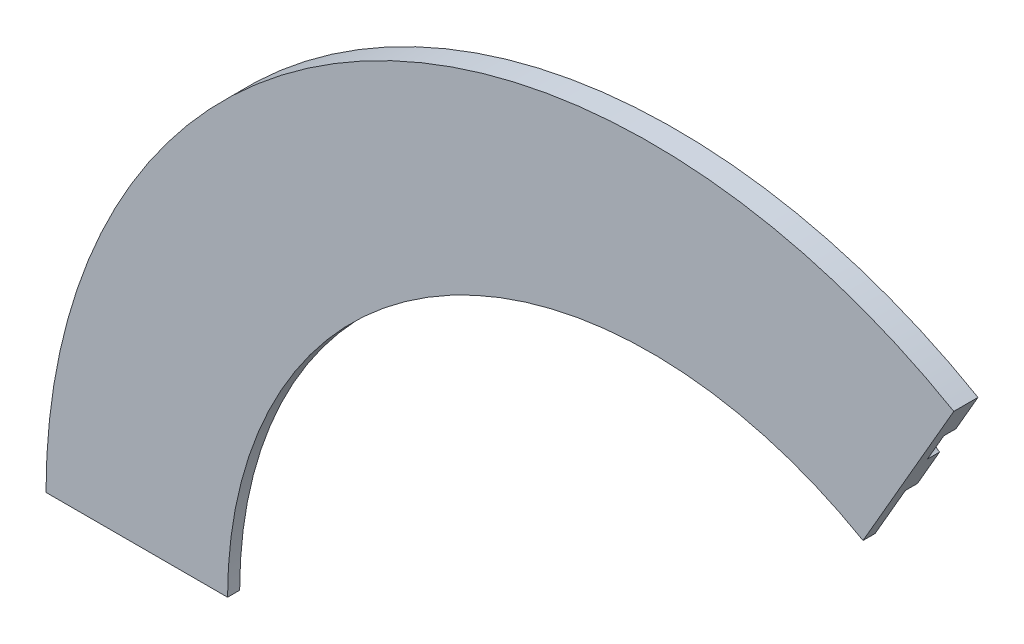
ISO-10303-21;
HEADER;
FILE_DESCRIPTION(('STEP AP214'),'2;1');
FILE_NAME('part.step','',(''),(''),'','','');
FILE_SCHEMA(('AUTOMOTIVE_DESIGN { 1 0 10303 214 1 1 1 1 }'));
ENDSEC;
DATA;
#1=APPLICATION_CONTEXT('core data for automotive mechanical design processes');
#2=APPLICATION_PROTOCOL_DEFINITION('international standard','automotive_design',2000,#1);
#3=PRODUCT_CONTEXT('',#1,'mechanical');
#4=PRODUCT('Part','Part','',(#3));
#5=PRODUCT_RELATED_PRODUCT_CATEGORY('part','',(#4));
#6=PRODUCT_DEFINITION_FORMATION('','',#4);
#7=PRODUCT_DEFINITION_CONTEXT('part definition',#1,'design');
#8=PRODUCT_DEFINITION('design','',#6,#7);
#9=PRODUCT_DEFINITION_SHAPE('','',#8);
#10=(LENGTH_UNIT() NAMED_UNIT(*) SI_UNIT(.MILLI.,.METRE.));
#11=(NAMED_UNIT(*) PLANE_ANGLE_UNIT() SI_UNIT($,.RADIAN.));
#12=(NAMED_UNIT(*) SI_UNIT($,.STERADIAN.) SOLID_ANGLE_UNIT());
#13=UNCERTAINTY_MEASURE_WITH_UNIT(LENGTH_MEASURE(1.E-05),#10,'distance_accuracy_value','');
#14=(GEOMETRIC_REPRESENTATION_CONTEXT(3) GLOBAL_UNCERTAINTY_ASSIGNED_CONTEXT((#13)) GLOBAL_UNIT_ASSIGNED_CONTEXT((#10,
#11,#12)) REPRESENTATION_CONTEXT('',''));
#15=CARTESIAN_POINT('',(0.,0.,0.));
#16=DIRECTION('',(0.,0.,1.));
#17=DIRECTION('',(1.,0.,0.));
#18=AXIS2_PLACEMENT_3D('',#15,#16,#17);
#19=CARTESIAN_POINT('',(0.,0.,0.));
#20=DIRECTION('',(0.,0.,1.));
#21=DIRECTION('',(1.,0.,0.));
#22=AXIS2_PLACEMENT_3D('',#19,#20,#21);
#23=PLANE('',#22);
#24=CARTESIAN_POINT('',(-176.066568132085,37.4241043471955,0.));
#25=DIRECTION('',(0.,0.,1.));
#26=DIRECTION('',(1.,0.,0.));
#27=AXIS2_PLACEMENT_3D('',#24,#25,#26);
#28=CIRCLE('',#27,5.40000000000004);
#29=CARTESIAN_POINT('',(-170.666568132085,37.4241043471955,0.));
#30=VERTEX_POINT('',#29);
#31=EDGE_CURVE('E141',#30,#30,#28,.T.);
#32=ORIENTED_EDGE('',*,*,#31,.T.);
#33=EDGE_LOOP('',(#32));
#34=FACE_BOUND('',#33,.T.);
#35=CARTESIAN_POINT('',(-164.438182375669,73.2125957536425,0.));
#36=DIRECTION('',(0.,0.,1.));
#37=DIRECTION('',(1.,0.,0.));
#38=AXIS2_PLACEMENT_3D('',#35,#36,#37);
#39=CIRCLE('',#38,5.40000000000011);
#40=CARTESIAN_POINT('',(-159.038182375669,73.2125957536425,0.));
#41=VERTEX_POINT('',#40);
#42=EDGE_CURVE('E144',#41,#41,#39,.T.);
#43=ORIENTED_EDGE('',*,*,#42,.T.);
#44=EDGE_LOOP('',(#43));
#45=FACE_BOUND('',#44,.T.);
#46=CARTESIAN_POINT('',(-145.623058987491,105.801345412644,0.));
#47=DIRECTION('',(0.,0.,1.));
#48=DIRECTION('',(1.,0.,0.));
#49=AXIS2_PLACEMENT_3D('',#46,#47,#48);
#50=CIRCLE('',#49,5.40000000000024);
#51=CARTESIAN_POINT('',(-140.223058987491,105.801345412644,0.));
#52=VERTEX_POINT('',#51);
#53=EDGE_CURVE('E147',#52,#52,#50,.T.);
#54=ORIENTED_EDGE('',*,*,#53,.T.);
#55=EDGE_LOOP('',(#54));
#56=FACE_BOUND('',#55,.T.);
#57=CARTESIAN_POINT('',(-120.443509144596,133.76606858593,0.));
#58=DIRECTION('',(0.,0.,1.));
#59=DIRECTION('',(1.,0.,0.));
#60=AXIS2_PLACEMENT_3D('',#57,#58,#59);
#61=CIRCLE('',#60,5.40000000000034);
#62=CARTESIAN_POINT('',(-115.043509144595,133.76606858593,0.));
#63=VERTEX_POINT('',#62);
#64=EDGE_CURVE('E150',#63,#63,#61,.T.);
#65=ORIENTED_EDGE('',*,*,#64,.T.);
#66=EDGE_LOOP('',(#65));
#67=FACE_BOUND('',#66,.T.);
#68=CARTESIAN_POINT('',(-90.0000000000019,155.884572681198,0.));
#69=DIRECTION('',(0.,0.,1.));
#70=DIRECTION('',(1.,0.,0.));
#71=AXIS2_PLACEMENT_3D('',#68,#69,#70);
#72=CIRCLE('',#71,5.40000000000049);
#73=CARTESIAN_POINT('',(-84.6000000000014,155.884572681198,0.));
#74=VERTEX_POINT('',#73);
#75=EDGE_CURVE('E153',#74,#74,#72,.T.);
#76=ORIENTED_EDGE('',*,*,#75,.T.);
#77=EDGE_LOOP('',(#76));
#78=FACE_BOUND('',#77,.T.);
#79=CARTESIAN_POINT('',(-55.6230589874907,171.190172933128,0.));
#80=DIRECTION('',(0.,0.,1.));
#81=DIRECTION('',(1.,0.,0.));
#82=AXIS2_PLACEMENT_3D('',#79,#80,#81);
#83=CIRCLE('',#82,5.39999999999888);
#84=CARTESIAN_POINT('',(-50.2230589874918,171.190172933128,0.));
#85=VERTEX_POINT('',#84);
#86=EDGE_CURVE('E156',#85,#85,#83,.T.);
#87=ORIENTED_EDGE('',*,*,#86,.T.);
#88=EDGE_LOOP('',(#87));
#89=FACE_BOUND('',#88,.T.);
#90=CARTESIAN_POINT('',(-18.8151233881776,179.013941166289,0.));
#91=DIRECTION('',(0.,0.,1.));
#92=DIRECTION('',(1.,0.,0.));
#93=AXIS2_PLACEMENT_3D('',#90,#91,#92);
#94=CIRCLE('',#93,5.39999999999871);
#95=CARTESIAN_POINT('',(-13.4151233881788,179.013941166289,0.));
#96=VERTEX_POINT('',#95);
#97=EDGE_CURVE('E159',#96,#96,#94,.T.);
#98=ORIENTED_EDGE('',*,*,#97,.T.);
#99=EDGE_LOOP('',(#98));
#100=FACE_BOUND('',#99,.T.);
#101=CARTESIAN_POINT('',(18.8151233881785,179.013941166289,0.));
#102=DIRECTION('',(0.,0.,1.));
#103=DIRECTION('',(1.,0.,0.));
#104=AXIS2_PLACEMENT_3D('',#101,#102,#103);
#105=CIRCLE('',#104,5.39999999999827);
#106=CARTESIAN_POINT('',(24.2151233881768,179.013941166289,0.));
#107=VERTEX_POINT('',#106);
#108=EDGE_CURVE('E162',#107,#107,#105,.T.);
#109=ORIENTED_EDGE('',*,*,#108,.T.);
#110=EDGE_LOOP('',(#109));
#111=FACE_BOUND('',#110,.T.);
#112=CARTESIAN_POINT('',(55.6230589874906,171.190172933128,0.));
#113=DIRECTION('',(0.,0.,1.));
#114=DIRECTION('',(1.,0.,0.));
#115=AXIS2_PLACEMENT_3D('',#112,#113,#114);
#116=CIRCLE('',#115,5.39999999999888);
#117=CARTESIAN_POINT('',(61.0230589874895,171.190172933128,0.));
#118=VERTEX_POINT('',#117);
#119=EDGE_CURVE('E165',#118,#118,#116,.T.);
#120=ORIENTED_EDGE('',*,*,#119,.T.);
#121=EDGE_LOOP('',(#120));
#122=FACE_BOUND('',#121,.T.);
#123=CARTESIAN_POINT('',(0.,0.,0.));
#124=DIRECTION('',(0.,0.,1.));
#125=DIRECTION('',(1.,0.,0.));
#126=AXIS2_PLACEMENT_3D('',#123,#124,#125);
#127=CIRCLE('',#126,200.);
#128=CARTESIAN_POINT('',(100.000000000001,173.205080756887,0.));
#129=VERTEX_POINT('',#128);
#130=CARTESIAN_POINT('',(-200.,0.,0.));
#131=VERTEX_POINT('',#130);
#132=EDGE_CURVE('E127',#129,#131,#127,.T.);
#133=ORIENTED_EDGE('',*,*,#132,.F.);
#134=DIRECTION('',(0.500000000000004,0.866025403784436,0.));
#135=VECTOR('',#134,1.);
#136=CARTESIAN_POINT('',(100.000000000001,173.205080756887,0.));
#137=LINE('',#136,#135);
#138=CARTESIAN_POINT('',(92.7000000000004,160.561109861634,0.));
#139=VERTEX_POINT('',#138);
#140=EDGE_CURVE('E131',#139,#129,#137,.T.);
#141=ORIENTED_EDGE('',*,*,#140,.F.);
#142=CARTESIAN_POINT('',(90.0000000000002,155.884572681199,0.));
#143=DIRECTION('',(0.,0.,1.));
#144=DIRECTION('',(1.,0.,0.));
#145=AXIS2_PLACEMENT_3D('',#142,#143,#144);
#146=CIRCLE('',#145,5.39999999999904);
#147=CARTESIAN_POINT('',(87.3000000000014,151.208035500764,0.));
#148=VERTEX_POINT('',#147);
#149=EDGE_CURVE('E168',#139,#148,#146,.T.);
#150=ORIENTED_EDGE('',*,*,#149,.T.);
#151=CARTESIAN_POINT('',(80.0000000000006,138.56406460551,0.));
#152=VERTEX_POINT('',#151);
#153=EDGE_CURVE('E121',#152,#148,#137,.T.);
#154=ORIENTED_EDGE('',*,*,#153,.F.);
#155=CARTESIAN_POINT('',(0.,0.,0.));
#156=DIRECTION('',(0.,0.,1.));
#157=DIRECTION('',(1.,0.,0.));
#158=AXIS2_PLACEMENT_3D('',#155,#156,#157);
#159=CIRCLE('',#158,160.);
#160=CARTESIAN_POINT('',(-160.,0.,0.));
#161=VERTEX_POINT('',#160);
#162=EDGE_CURVE('E135',#152,#161,#159,.T.);
#163=ORIENTED_EDGE('',*,*,#162,.T.);
#164=DIRECTION('',(1.,0.,0.));
#165=VECTOR('',#164,1.);
#166=CARTESIAN_POINT('',(-140.,0.,0.));
#167=LINE('',#166,#165);
#168=CARTESIAN_POINT('',(-174.6,0.,0.));
#169=VERTEX_POINT('',#168);
#170=EDGE_CURVE('E132',#169,#161,#167,.T.);
#171=ORIENTED_EDGE('',*,*,#170,.F.);
#172=CARTESIAN_POINT('',(-180.,-1.23512311489549E-12,0.));
#173=DIRECTION('',(0.,0.,1.));
#174=DIRECTION('',(1.,0.,0.));
#175=AXIS2_PLACEMENT_3D('',#172,#173,#174);
#176=CIRCLE('',#175,5.39999999999999);
#177=CARTESIAN_POINT('',(-185.4,0.,0.));
#178=VERTEX_POINT('',#177);
#179=EDGE_CURVE('E130',#169,#178,#176,.T.);
#180=ORIENTED_EDGE('',*,*,#179,.T.);
#181=EDGE_CURVE('E112',#131,#178,#167,.T.);
#182=ORIENTED_EDGE('',*,*,#181,.F.);
#183=EDGE_LOOP('',(#133,#141,#150,#154,#163,#171,#180,#182));
#184=FACE_BOUND('',#183,.T.);
#185=ADVANCED_FACE('F35',(#34,#45,#56,#67,#78,#89,#100,#111,#122,#184),#23,.F.);
#186=CARTESIAN_POINT('',(0.,0.,4.));
#187=DIRECTION('',(0.,0.,-1.));
#188=DIRECTION('',(-1.,0.,0.));
#189=AXIS2_PLACEMENT_3D('',#186,#187,#188);
#190=CYLINDRICAL_SURFACE('',#189,200.);
#191=CARTESIAN_POINT('',(0.,0.,8.));
#192=DIRECTION('',(0.,0.,1.));
#193=DIRECTION('',(1.,0.,0.));
#194=AXIS2_PLACEMENT_3D('',#191,#192,#193);
#195=CIRCLE('',#194,200.);
#196=CARTESIAN_POINT('',(100.000000000001,173.205080756887,8.));
#197=VERTEX_POINT('',#196);
#198=CARTESIAN_POINT('',(-200.,0.,8.));
#199=VERTEX_POINT('',#198);
#200=EDGE_CURVE('E207',#197,#199,#195,.T.);
#201=ORIENTED_EDGE('',*,*,#200,.F.);
#202=DIRECTION('',(0.,0.,-1.));
#203=VECTOR('',#202,1.);
#204=CARTESIAN_POINT('',(100.000000000001,173.205080756887,10.));
#205=LINE('',#204,#203);
#206=EDGE_CURVE('E120',#197,#129,#205,.T.);
#207=ORIENTED_EDGE('',*,*,#206,.T.);
#208=ORIENTED_EDGE('',*,*,#132,.T.);
#209=DIRECTION('',(0.,0.,-1.));
#210=VECTOR('',#209,1.);
#211=CARTESIAN_POINT('',(-200.,0.,10.));
#212=LINE('',#211,#210);
#213=EDGE_CURVE('E109',#199,#131,#212,.T.);
#214=ORIENTED_EDGE('',*,*,#213,.F.);
#215=EDGE_LOOP('',(#201,#207,#208,#214));
#216=FACE_BOUND('',#215,.T.);
#217=ADVANCED_FACE('F37',(#216),#190,.T.);
#218=CARTESIAN_POINT('',(0.,0.,4.));
#219=DIRECTION('',(0.,0.,-1.));
#220=DIRECTION('',(-1.,0.,0.));
#221=AXIS2_PLACEMENT_3D('',#218,#219,#220);
#222=CYLINDRICAL_SURFACE('',#221,160.);
#223=DIRECTION('',(0.,0.,-1.));
#224=VECTOR('',#223,1.);
#225=CARTESIAN_POINT('',(80.0000000000006,138.56406460551,4.));
#226=LINE('',#225,#224);
#227=CARTESIAN_POINT('',(80.0000000000007,138.56406460551,4.));
#228=VERTEX_POINT('',#227);
#229=EDGE_CURVE('E222',#228,#152,#226,.T.);
#230=ORIENTED_EDGE('',*,*,#229,.F.);
#231=CARTESIAN_POINT('',(0.,0.,4.));
#232=DIRECTION('',(0.,0.,1.));
#233=DIRECTION('',(1.,0.,0.));
#234=AXIS2_PLACEMENT_3D('',#231,#232,#233);
#235=CIRCLE('',#234,160.);
#236=CARTESIAN_POINT('',(-160.,0.,4.));
#237=VERTEX_POINT('',#236);
#238=EDGE_CURVE('E171',#228,#237,#235,.T.);
#239=ORIENTED_EDGE('',*,*,#238,.T.);
#240=DIRECTION('',(0.,0.,-1.));
#241=VECTOR('',#240,1.);
#242=CARTESIAN_POINT('',(-160.,0.,4.));
#243=LINE('',#242,#241);
#244=EDGE_CURVE('E235',#161,#237,#243,.F.);
#245=ORIENTED_EDGE('',*,*,#244,.F.);
#246=ORIENTED_EDGE('',*,*,#162,.F.);
#247=EDGE_LOOP('',(#230,#239,#245,#246));
#248=FACE_BOUND('',#247,.T.);
#249=ADVANCED_FACE('F276',(#248),#222,.F.);
#250=CARTESIAN_POINT('',(-180.,-1.23512311489549E-12,4.));
#251=DIRECTION('',(0.,0.,-1.));
#252=DIRECTION('',(-1.,0.,0.));
#253=AXIS2_PLACEMENT_3D('',#250,#251,#252);
#254=CYLINDRICAL_SURFACE('',#253,5.39999999999999);
#255=DIRECTION('',(0.,0.,-1.));
#256=VECTOR('',#255,1.);
#257=CARTESIAN_POINT('',(-174.6,0.,4.));
#258=LINE('',#257,#256);
#259=CARTESIAN_POINT('',(-174.6,0.,4.));
#260=VERTEX_POINT('',#259);
#261=EDGE_CURVE('E228',#260,#169,#258,.T.);
#262=ORIENTED_EDGE('',*,*,#261,.F.);
#263=CARTESIAN_POINT('',(-180.,-1.23512311489549E-12,4.));
#264=DIRECTION('',(0.,0.,1.));
#265=DIRECTION('',(1.,0.,0.));
#266=AXIS2_PLACEMENT_3D('',#263,#264,#265);
#267=CIRCLE('',#266,5.39999999999999);
#268=CARTESIAN_POINT('',(-185.4,0.,4.));
#269=VERTEX_POINT('',#268);
#270=EDGE_CURVE('E174',#260,#269,#267,.T.);
#271=ORIENTED_EDGE('',*,*,#270,.T.);
#272=DIRECTION('',(0.,0.,-1.));
#273=VECTOR('',#272,1.);
#274=CARTESIAN_POINT('',(-185.4,0.,4.));
#275=LINE('',#274,#273);
#276=EDGE_CURVE('E230',#178,#269,#275,.F.);
#277=ORIENTED_EDGE('',*,*,#276,.F.);
#278=ORIENTED_EDGE('',*,*,#179,.F.);
#279=EDGE_LOOP('',(#262,#271,#277,#278));
#280=FACE_BOUND('',#279,.T.);
#281=ADVANCED_FACE('F281',(#280),#254,.F.);
#282=CARTESIAN_POINT('',(-176.066568132085,37.4241043471955,4.));
#283=DIRECTION('',(0.,0.,-1.));
#284=DIRECTION('',(-1.,0.,0.));
#285=AXIS2_PLACEMENT_3D('',#282,#283,#284);
#286=CYLINDRICAL_SURFACE('',#285,5.40000000000004);
#287=CARTESIAN_POINT('',(-176.066568132085,37.4241043471955,4.));
#288=DIRECTION('',(0.,0.,1.));
#289=DIRECTION('',(1.,0.,0.));
#290=AXIS2_PLACEMENT_3D('',#287,#288,#289);
#291=CIRCLE('',#290,5.40000000000004);
#292=CARTESIAN_POINT('',(-170.666568132085,37.4241043471955,4.));
#293=VERTEX_POINT('',#292);
#294=EDGE_CURVE('E177',#293,#293,#291,.T.);
#295=ORIENTED_EDGE('',*,*,#294,.T.);
#296=EDGE_LOOP('',(#295));
#297=FACE_BOUND('',#296,.T.);
#298=ORIENTED_EDGE('',*,*,#31,.F.);
#299=EDGE_LOOP('',(#298));
#300=FACE_BOUND('',#299,.T.);
#301=ADVANCED_FACE('F285',(#297,#300),#286,.F.);
#302=CARTESIAN_POINT('',(-164.438182375669,73.2125957536425,4.));
#303=DIRECTION('',(0.,0.,-1.));
#304=DIRECTION('',(-1.,0.,0.));
#305=AXIS2_PLACEMENT_3D('',#302,#303,#304);
#306=CYLINDRICAL_SURFACE('',#305,5.40000000000011);
#307=CARTESIAN_POINT('',(-164.438182375669,73.2125957536425,4.));
#308=DIRECTION('',(0.,0.,1.));
#309=DIRECTION('',(1.,0.,0.));
#310=AXIS2_PLACEMENT_3D('',#307,#308,#309);
#311=CIRCLE('',#310,5.40000000000011);
#312=CARTESIAN_POINT('',(-159.038182375669,73.2125957536425,4.));
#313=VERTEX_POINT('',#312);
#314=EDGE_CURVE('E180',#313,#313,#311,.T.);
#315=ORIENTED_EDGE('',*,*,#314,.T.);
#316=EDGE_LOOP('',(#315));
#317=FACE_BOUND('',#316,.T.);
#318=ORIENTED_EDGE('',*,*,#42,.F.);
#319=EDGE_LOOP('',(#318));
#320=FACE_BOUND('',#319,.T.);
#321=ADVANCED_FACE('F289',(#317,#320),#306,.F.);
#322=CARTESIAN_POINT('',(-145.623058987491,105.801345412644,4.));
#323=DIRECTION('',(0.,0.,-1.));
#324=DIRECTION('',(-1.,0.,0.));
#325=AXIS2_PLACEMENT_3D('',#322,#323,#324);
#326=CYLINDRICAL_SURFACE('',#325,5.40000000000024);
#327=CARTESIAN_POINT('',(-145.623058987491,105.801345412644,4.));
#328=DIRECTION('',(0.,0.,1.));
#329=DIRECTION('',(1.,0.,0.));
#330=AXIS2_PLACEMENT_3D('',#327,#328,#329);
#331=CIRCLE('',#330,5.40000000000024);
#332=CARTESIAN_POINT('',(-140.223058987491,105.801345412644,4.));
#333=VERTEX_POINT('',#332);
#334=EDGE_CURVE('E183',#333,#333,#331,.T.);
#335=ORIENTED_EDGE('',*,*,#334,.T.);
#336=EDGE_LOOP('',(#335));
#337=FACE_BOUND('',#336,.T.);
#338=ORIENTED_EDGE('',*,*,#53,.F.);
#339=EDGE_LOOP('',(#338));
#340=FACE_BOUND('',#339,.T.);
#341=ADVANCED_FACE('F293',(#337,#340),#326,.F.);
#342=CARTESIAN_POINT('',(-120.443509144596,133.76606858593,4.));
#343=DIRECTION('',(0.,0.,-1.));
#344=DIRECTION('',(-1.,0.,0.));
#345=AXIS2_PLACEMENT_3D('',#342,#343,#344);
#346=CYLINDRICAL_SURFACE('',#345,5.40000000000034);
#347=CARTESIAN_POINT('',(-120.443509144596,133.76606858593,4.));
#348=DIRECTION('',(0.,0.,1.));
#349=DIRECTION('',(1.,0.,0.));
#350=AXIS2_PLACEMENT_3D('',#347,#348,#349);
#351=CIRCLE('',#350,5.40000000000034);
#352=CARTESIAN_POINT('',(-115.043509144595,133.76606858593,4.));
#353=VERTEX_POINT('',#352);
#354=EDGE_CURVE('E186',#353,#353,#351,.T.);
#355=ORIENTED_EDGE('',*,*,#354,.T.);
#356=EDGE_LOOP('',(#355));
#357=FACE_BOUND('',#356,.T.);
#358=ORIENTED_EDGE('',*,*,#64,.F.);
#359=EDGE_LOOP('',(#358));
#360=FACE_BOUND('',#359,.T.);
#361=ADVANCED_FACE('F297',(#357,#360),#346,.F.);
#362=CARTESIAN_POINT('',(-90.0000000000019,155.884572681198,4.));
#363=DIRECTION('',(0.,0.,-1.));
#364=DIRECTION('',(-1.,0.,0.));
#365=AXIS2_PLACEMENT_3D('',#362,#363,#364);
#366=CYLINDRICAL_SURFACE('',#365,5.40000000000049);
#367=CARTESIAN_POINT('',(-90.0000000000019,155.884572681198,4.));
#368=DIRECTION('',(0.,0.,1.));
#369=DIRECTION('',(1.,0.,0.));
#370=AXIS2_PLACEMENT_3D('',#367,#368,#369);
#371=CIRCLE('',#370,5.40000000000049);
#372=CARTESIAN_POINT('',(-84.6000000000014,155.884572681198,4.));
#373=VERTEX_POINT('',#372);
#374=EDGE_CURVE('E189',#373,#373,#371,.T.);
#375=ORIENTED_EDGE('',*,*,#374,.T.);
#376=EDGE_LOOP('',(#375));
#377=FACE_BOUND('',#376,.T.);
#378=ORIENTED_EDGE('',*,*,#75,.F.);
#379=EDGE_LOOP('',(#378));
#380=FACE_BOUND('',#379,.T.);
#381=ADVANCED_FACE('F301',(#377,#380),#366,.F.);
#382=CARTESIAN_POINT('',(-55.6230589874907,171.190172933128,4.));
#383=DIRECTION('',(0.,0.,-1.));
#384=DIRECTION('',(-1.,0.,0.));
#385=AXIS2_PLACEMENT_3D('',#382,#383,#384);
#386=CYLINDRICAL_SURFACE('',#385,5.39999999999888);
#387=CARTESIAN_POINT('',(-55.6230589874907,171.190172933128,4.));
#388=DIRECTION('',(0.,0.,1.));
#389=DIRECTION('',(1.,0.,0.));
#390=AXIS2_PLACEMENT_3D('',#387,#388,#389);
#391=CIRCLE('',#390,5.39999999999888);
#392=CARTESIAN_POINT('',(-50.2230589874918,171.190172933128,4.));
#393=VERTEX_POINT('',#392);
#394=EDGE_CURVE('E192',#393,#393,#391,.T.);
#395=ORIENTED_EDGE('',*,*,#394,.T.);
#396=EDGE_LOOP('',(#395));
#397=FACE_BOUND('',#396,.T.);
#398=ORIENTED_EDGE('',*,*,#86,.F.);
#399=EDGE_LOOP('',(#398));
#400=FACE_BOUND('',#399,.T.);
#401=ADVANCED_FACE('F305',(#397,#400),#386,.F.);
#402=CARTESIAN_POINT('',(-18.8151233881776,179.013941166289,4.));
#403=DIRECTION('',(0.,0.,-1.));
#404=DIRECTION('',(-1.,0.,0.));
#405=AXIS2_PLACEMENT_3D('',#402,#403,#404);
#406=CYLINDRICAL_SURFACE('',#405,5.39999999999871);
#407=CARTESIAN_POINT('',(-18.8151233881776,179.013941166289,4.));
#408=DIRECTION('',(0.,0.,1.));
#409=DIRECTION('',(1.,0.,0.));
#410=AXIS2_PLACEMENT_3D('',#407,#408,#409);
#411=CIRCLE('',#410,5.39999999999871);
#412=CARTESIAN_POINT('',(-13.4151233881788,179.013941166289,4.));
#413=VERTEX_POINT('',#412);
#414=EDGE_CURVE('E195',#413,#413,#411,.T.);
#415=ORIENTED_EDGE('',*,*,#414,.T.);
#416=EDGE_LOOP('',(#415));
#417=FACE_BOUND('',#416,.T.);
#418=ORIENTED_EDGE('',*,*,#97,.F.);
#419=EDGE_LOOP('',(#418));
#420=FACE_BOUND('',#419,.T.);
#421=ADVANCED_FACE('F309',(#417,#420),#406,.F.);
#422=CARTESIAN_POINT('',(18.8151233881785,179.013941166289,4.));
#423=DIRECTION('',(0.,0.,-1.));
#424=DIRECTION('',(-1.,0.,0.));
#425=AXIS2_PLACEMENT_3D('',#422,#423,#424);
#426=CYLINDRICAL_SURFACE('',#425,5.39999999999827);
#427=CARTESIAN_POINT('',(18.8151233881785,179.013941166289,4.));
#428=DIRECTION('',(0.,0.,1.));
#429=DIRECTION('',(1.,0.,0.));
#430=AXIS2_PLACEMENT_3D('',#427,#428,#429);
#431=CIRCLE('',#430,5.39999999999827);
#432=CARTESIAN_POINT('',(24.2151233881768,179.013941166289,4.));
#433=VERTEX_POINT('',#432);
#434=EDGE_CURVE('E198',#433,#433,#431,.T.);
#435=ORIENTED_EDGE('',*,*,#434,.T.);
#436=EDGE_LOOP('',(#435));
#437=FACE_BOUND('',#436,.T.);
#438=ORIENTED_EDGE('',*,*,#108,.F.);
#439=EDGE_LOOP('',(#438));
#440=FACE_BOUND('',#439,.T.);
#441=ADVANCED_FACE('F313',(#437,#440),#426,.F.);
#442=CARTESIAN_POINT('',(55.6230589874906,171.190172933128,4.));
#443=DIRECTION('',(0.,0.,-1.));
#444=DIRECTION('',(-1.,0.,0.));
#445=AXIS2_PLACEMENT_3D('',#442,#443,#444);
#446=CYLINDRICAL_SURFACE('',#445,5.39999999999888);
#447=CARTESIAN_POINT('',(55.6230589874906,171.190172933128,4.));
#448=DIRECTION('',(0.,0.,1.));
#449=DIRECTION('',(1.,0.,0.));
#450=AXIS2_PLACEMENT_3D('',#447,#448,#449);
#451=CIRCLE('',#450,5.39999999999888);
#452=CARTESIAN_POINT('',(61.0230589874895,171.190172933128,4.));
#453=VERTEX_POINT('',#452);
#454=EDGE_CURVE('E201',#453,#453,#451,.T.);
#455=ORIENTED_EDGE('',*,*,#454,.T.);
#456=EDGE_LOOP('',(#455));
#457=FACE_BOUND('',#456,.T.);
#458=ORIENTED_EDGE('',*,*,#119,.F.);
#459=EDGE_LOOP('',(#458));
#460=FACE_BOUND('',#459,.T.);
#461=ADVANCED_FACE('F263',(#457,#460),#446,.F.);
#462=CARTESIAN_POINT('',(90.0000000000002,155.884572681199,4.));
#463=DIRECTION('',(0.,0.,-1.));
#464=DIRECTION('',(-1.,0.,0.));
#465=AXIS2_PLACEMENT_3D('',#462,#463,#464);
#466=CYLINDRICAL_SURFACE('',#465,5.39999999999904);
#467=DIRECTION('',(0.,0.,-1.));
#468=VECTOR('',#467,1.);
#469=CARTESIAN_POINT('',(92.7000000000004,160.561109861634,4.));
#470=LINE('',#469,#468);
#471=CARTESIAN_POINT('',(92.7000000000004,160.561109861634,4.));
#472=VERTEX_POINT('',#471);
#473=EDGE_CURVE('E213',#472,#139,#470,.T.);
#474=ORIENTED_EDGE('',*,*,#473,.F.);
#475=CARTESIAN_POINT('',(90.0000000000002,155.884572681199,4.));
#476=DIRECTION('',(0.,0.,1.));
#477=DIRECTION('',(1.,0.,0.));
#478=AXIS2_PLACEMENT_3D('',#475,#476,#477);
#479=CIRCLE('',#478,5.39999999999904);
#480=CARTESIAN_POINT('',(87.3000000000014,151.208035500764,4.));
#481=VERTEX_POINT('',#480);
#482=EDGE_CURVE('E204',#472,#481,#479,.T.);
#483=ORIENTED_EDGE('',*,*,#482,.T.);
#484=DIRECTION('',(0.,0.,-1.));
#485=VECTOR('',#484,1.);
#486=CARTESIAN_POINT('',(87.3000000000014,151.208035500764,4.));
#487=LINE('',#486,#485);
#488=EDGE_CURVE('E217',#148,#481,#487,.F.);
#489=ORIENTED_EDGE('',*,*,#488,.F.);
#490=ORIENTED_EDGE('',*,*,#149,.F.);
#491=EDGE_LOOP('',(#474,#483,#489,#490));
#492=FACE_BOUND('',#491,.T.);
#493=ADVANCED_FACE('F248',(#492),#466,.F.);
#494=CARTESIAN_POINT('',(0.,0.,4.));
#495=DIRECTION('',(0.,0.,1.));
#496=DIRECTION('',(1.,0.,0.));
#497=AXIS2_PLACEMENT_3D('',#494,#495,#496);
#498=PLANE('',#497);
#499=ORIENTED_EDGE('',*,*,#482,.F.);
#500=DIRECTION('',(-0.500000000000004,-0.866025403784436,0.));
#501=VECTOR('',#500,1.);
#502=CARTESIAN_POINT('',(0.,0.,4.));
#503=LINE('',#502,#501);
#504=EDGE_CURVE('E219',#472,#481,#503,.T.);
#505=ORIENTED_EDGE('',*,*,#504,.T.);
#506=EDGE_LOOP('',(#499,#505));
#507=FACE_BOUND('',#506,.T.);
#508=ADVANCED_FACE('F251',(#507),#498,.F.);
#509=ORIENTED_EDGE('',*,*,#454,.F.);
#510=EDGE_LOOP('',(#509));
#511=FACE_BOUND('',#510,.T.);
#512=ADVANCED_FACE('F253',(#511),#498,.F.);
#513=ORIENTED_EDGE('',*,*,#434,.F.);
#514=EDGE_LOOP('',(#513));
#515=FACE_BOUND('',#514,.T.);
#516=ADVANCED_FACE('F260',(#515),#498,.F.);
#517=ORIENTED_EDGE('',*,*,#414,.F.);
#518=EDGE_LOOP('',(#517));
#519=FACE_BOUND('',#518,.T.);
#520=ADVANCED_FACE('F356',(#519),#498,.F.);
#521=ORIENTED_EDGE('',*,*,#394,.F.);
#522=EDGE_LOOP('',(#521));
#523=FACE_BOUND('',#522,.T.);
#524=ADVANCED_FACE('F365',(#523),#498,.F.);
#525=ORIENTED_EDGE('',*,*,#374,.F.);
#526=EDGE_LOOP('',(#525));
#527=FACE_BOUND('',#526,.T.);
#528=ADVANCED_FACE('F374',(#527),#498,.F.);
#529=ORIENTED_EDGE('',*,*,#354,.F.);
#530=EDGE_LOOP('',(#529));
#531=FACE_BOUND('',#530,.T.);
#532=ADVANCED_FACE('F383',(#531),#498,.F.);
#533=ORIENTED_EDGE('',*,*,#334,.F.);
#534=EDGE_LOOP('',(#533));
#535=FACE_BOUND('',#534,.T.);
#536=ADVANCED_FACE('F391',(#535),#498,.F.);
#537=ORIENTED_EDGE('',*,*,#314,.F.);
#538=EDGE_LOOP('',(#537));
#539=FACE_BOUND('',#538,.T.);
#540=ADVANCED_FACE('F400',(#539),#498,.F.);
#541=ORIENTED_EDGE('',*,*,#294,.F.);
#542=EDGE_LOOP('',(#541));
#543=FACE_BOUND('',#542,.T.);
#544=ADVANCED_FACE('F409',(#543),#498,.F.);
#545=ORIENTED_EDGE('',*,*,#270,.F.);
#546=DIRECTION('',(-1.,0.,0.));
#547=VECTOR('',#546,1.);
#548=CARTESIAN_POINT('',(0.,0.,4.));
#549=LINE('',#548,#547);
#550=EDGE_CURVE('E232',#260,#269,#549,.T.);
#551=ORIENTED_EDGE('',*,*,#550,.T.);
#552=EDGE_LOOP('',(#545,#551));
#553=FACE_BOUND('',#552,.T.);
#554=ADVANCED_FACE('F268',(#553),#498,.F.);
#555=ORIENTED_EDGE('',*,*,#238,.F.);
#556=DIRECTION('',(-0.500000000000004,-0.866025403784436,0.));
#557=VECTOR('',#556,1.);
#558=CARTESIAN_POINT('',(0.,0.,4.));
#559=LINE('',#558,#557);
#560=CARTESIAN_POINT('',(70.0000000000006,121.243556529821,4.));
#561=VERTEX_POINT('',#560);
#562=EDGE_CURVE('E224',#228,#561,#559,.T.);
#563=ORIENTED_EDGE('',*,*,#562,.T.);
#564=CARTESIAN_POINT('',(0.,0.,4.));
#565=DIRECTION('',(0.,0.,1.));
#566=DIRECTION('',(1.,0.,0.));
#567=AXIS2_PLACEMENT_3D('',#564,#565,#566);
#568=CIRCLE('',#567,140.);
#569=CARTESIAN_POINT('',(-140.,0.,4.));
#570=VERTEX_POINT('',#569);
#571=EDGE_CURVE('E210',#561,#570,#568,.T.);
#572=ORIENTED_EDGE('',*,*,#571,.T.);
#573=DIRECTION('',(-1.,0.,0.));
#574=VECTOR('',#573,1.);
#575=CARTESIAN_POINT('',(0.,0.,4.));
#576=LINE('',#575,#574);
#577=EDGE_CURVE('E50',#570,#237,#576,.T.);
#578=ORIENTED_EDGE('',*,*,#577,.T.);
#579=EDGE_LOOP('',(#555,#563,#572,#578));
#580=FACE_BOUND('',#579,.T.);
#581=ADVANCED_FACE('F255',(#580),#498,.F.);
#582=CARTESIAN_POINT('',(0.,0.,8.));
#583=DIRECTION('',(0.,0.,1.));
#584=DIRECTION('',(1.,0.,0.));
#585=AXIS2_PLACEMENT_3D('',#582,#583,#584);
#586=PLANE('',#585);
#587=DIRECTION('',(-0.500000000000004,-0.866025403784436,0.));
#588=VECTOR('',#587,1.);
#589=CARTESIAN_POINT('',(0.,0.,8.));
#590=LINE('',#589,#588);
#591=CARTESIAN_POINT('',(70.0000000000006,121.243556529821,8.));
#592=VERTEX_POINT('',#591);
#593=EDGE_CURVE('E57',#197,#592,#590,.T.);
#594=ORIENTED_EDGE('',*,*,#593,.F.);
#595=ORIENTED_EDGE('',*,*,#200,.T.);
#596=DIRECTION('',(-1.,0.,0.));
#597=VECTOR('',#596,1.);
#598=CARTESIAN_POINT('',(0.,0.,8.));
#599=LINE('',#598,#597);
#600=CARTESIAN_POINT('',(-140.,0.,8.));
#601=VERTEX_POINT('',#600);
#602=EDGE_CURVE('E115',#601,#199,#599,.T.);
#603=ORIENTED_EDGE('',*,*,#602,.F.);
#604=CARTESIAN_POINT('',(0.,0.,8.));
#605=DIRECTION('',(0.,0.,1.));
#606=DIRECTION('',(1.,0.,0.));
#607=AXIS2_PLACEMENT_3D('',#604,#605,#606);
#608=CIRCLE('',#607,140.);
#609=EDGE_CURVE('E209',#592,#601,#608,.T.);
#610=ORIENTED_EDGE('',*,*,#609,.F.);
#611=EDGE_LOOP('',(#594,#595,#603,#610));
#612=FACE_BOUND('',#611,.T.);
#613=ADVANCED_FACE('F267',(#612),#586,.T.);
#614=CARTESIAN_POINT('',(0.,0.,8.));
#615=DIRECTION('',(0.,0.,-1.));
#616=DIRECTION('',(-1.,0.,0.));
#617=AXIS2_PLACEMENT_3D('',#614,#615,#616);
#618=CYLINDRICAL_SURFACE('',#617,140.);
#619=DIRECTION('',(0.,0.,-1.));
#620=VECTOR('',#619,1.);
#621=CARTESIAN_POINT('',(70.0000000000006,121.243556529821,8.));
#622=LINE('',#621,#620);
#623=EDGE_CURVE('E11',#592,#561,#622,.T.);
#624=ORIENTED_EDGE('',*,*,#623,.F.);
#625=ORIENTED_EDGE('',*,*,#609,.T.);
#626=DIRECTION('',(0.,0.,-1.));
#627=VECTOR('',#626,1.);
#628=CARTESIAN_POINT('',(-140.,0.,8.));
#629=LINE('',#628,#627);
#630=EDGE_CURVE('E43',#570,#601,#629,.F.);
#631=ORIENTED_EDGE('',*,*,#630,.F.);
#632=ORIENTED_EDGE('',*,*,#571,.F.);
#633=EDGE_LOOP('',(#624,#625,#631,#632));
#634=FACE_BOUND('',#633,.T.);
#635=ADVANCED_FACE('F439',(#634),#618,.F.);
#636=CARTESIAN_POINT('',(-140.,0.,10.));
#637=DIRECTION('',(0.,1.,0.));
#638=DIRECTION('',(0.,0.,1.));
#639=AXIS2_PLACEMENT_3D('',#636,#637,#638);
#640=PLANE('',#639);
#641=ORIENTED_EDGE('',*,*,#261,.T.);
#642=ORIENTED_EDGE('',*,*,#170,.T.);
#643=ORIENTED_EDGE('',*,*,#244,.T.);
#644=ORIENTED_EDGE('',*,*,#577,.F.);
#645=ORIENTED_EDGE('',*,*,#630,.T.);
#646=ORIENTED_EDGE('',*,*,#602,.T.);
#647=ORIENTED_EDGE('',*,*,#213,.T.);
#648=ORIENTED_EDGE('',*,*,#181,.T.);
#649=ORIENTED_EDGE('',*,*,#276,.T.);
#650=ORIENTED_EDGE('',*,*,#550,.F.);
#651=EDGE_LOOP('',(#641,#642,#643,#644,#645,#646,#647,#648,#649,#650));
#652=FACE_BOUND('',#651,.T.);
#653=ADVANCED_FACE('F111',(#652),#640,.F.);
#654=CARTESIAN_POINT('',(100.000000000001,173.205080756887,10.));
#655=DIRECTION('',(-0.866025403784436,0.500000000000004,0.));
#656=DIRECTION('',(-0.500000000000004,-0.866025403784436,0.));
#657=AXIS2_PLACEMENT_3D('',#654,#655,#656);
#658=PLANE('',#657);
#659=ORIENTED_EDGE('',*,*,#473,.T.);
#660=ORIENTED_EDGE('',*,*,#140,.T.);
#661=ORIENTED_EDGE('',*,*,#206,.F.);
#662=ORIENTED_EDGE('',*,*,#593,.T.);
#663=ORIENTED_EDGE('',*,*,#623,.T.);
#664=ORIENTED_EDGE('',*,*,#562,.F.);
#665=ORIENTED_EDGE('',*,*,#229,.T.);
#666=ORIENTED_EDGE('',*,*,#153,.T.);
#667=ORIENTED_EDGE('',*,*,#488,.T.);
#668=ORIENTED_EDGE('',*,*,#504,.F.);
#669=EDGE_LOOP('',(#659,#660,#661,#662,#663,#664,#665,#666,#667,#668));
#670=FACE_BOUND('',#669,.T.);
#671=ADVANCED_FACE('F242',(#670),#658,.F.);
#672=CLOSED_SHELL('',(#185,#217,#249,#281,#301,#321,#341,#361,#381,#401,#421,#441,#461,#493,
#508,#512,#516,#520,#524,#528,#532,#536,#540,#544,#554,#581,#613,#635,#653,#671));
#673=MANIFOLD_SOLID_BREP('B2',#672);
#674=ADVANCED_BREP_SHAPE_REPRESENTATION('',(#18,#673),#14);
#675=SHAPE_DEFINITION_REPRESENTATION(#9,#674);
ENDSEC;
END-ISO-10303-21;
